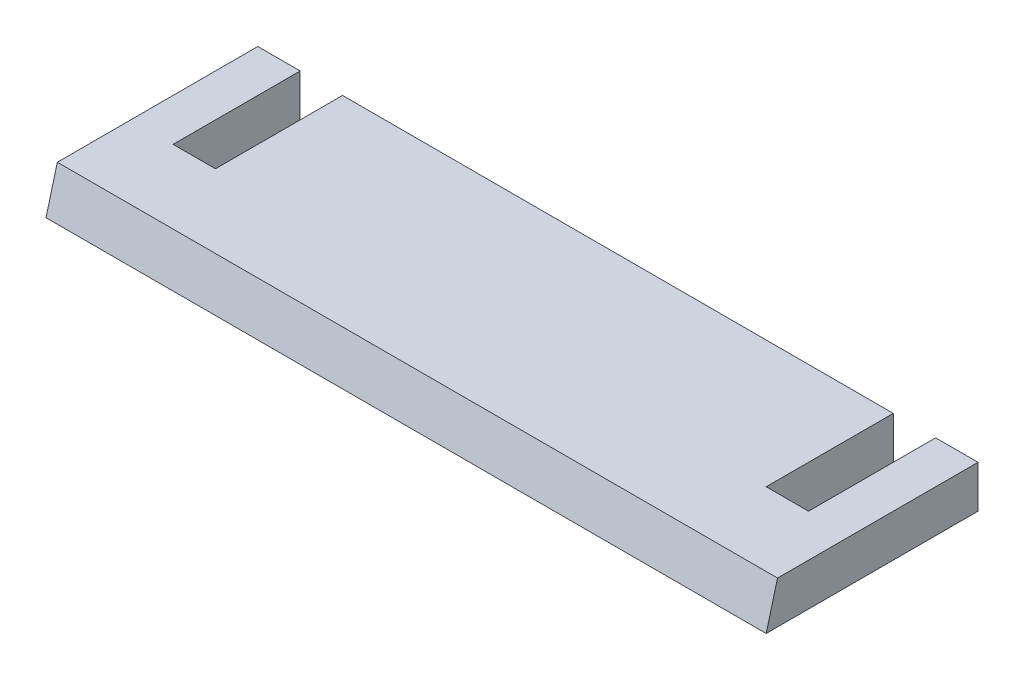
ISO-10303-21;
HEADER;
FILE_DESCRIPTION(('STEP AP214'),'2;1');
FILE_NAME('part.step','',(''),(''),'','','');
FILE_SCHEMA(('AUTOMOTIVE_DESIGN { 1 0 10303 214 1 1 1 1 }'));
ENDSEC;
DATA;
#1=APPLICATION_CONTEXT('core data for automotive mechanical design processes');
#2=APPLICATION_PROTOCOL_DEFINITION('international standard','automotive_design',2000,#1);
#3=PRODUCT_CONTEXT('',#1,'mechanical');
#4=PRODUCT('Part','Part','',(#3));
#5=PRODUCT_RELATED_PRODUCT_CATEGORY('part','',(#4));
#6=PRODUCT_DEFINITION_FORMATION('','',#4);
#7=PRODUCT_DEFINITION_CONTEXT('part definition',#1,'design');
#8=PRODUCT_DEFINITION('design','',#6,#7);
#9=PRODUCT_DEFINITION_SHAPE('','',#8);
#10=(LENGTH_UNIT() NAMED_UNIT(*) SI_UNIT(.MILLI.,.METRE.));
#11=(NAMED_UNIT(*) PLANE_ANGLE_UNIT() SI_UNIT($,.RADIAN.));
#12=(NAMED_UNIT(*) SI_UNIT($,.STERADIAN.) SOLID_ANGLE_UNIT());
#13=UNCERTAINTY_MEASURE_WITH_UNIT(LENGTH_MEASURE(1.E-05),#10,'distance_accuracy_value','');
#14=(GEOMETRIC_REPRESENTATION_CONTEXT(3) GLOBAL_UNCERTAINTY_ASSIGNED_CONTEXT((#13)) GLOBAL_UNIT_ASSIGNED_CONTEXT((#10,
#11,#12)) REPRESENTATION_CONTEXT('',''));
#15=CARTESIAN_POINT('',(0.,0.,0.));
#16=DIRECTION('',(0.,0.,1.));
#17=DIRECTION('',(1.,0.,0.));
#18=AXIS2_PLACEMENT_3D('',#15,#16,#17);
#19=CARTESIAN_POINT('',(75.,10.,-24.9999999999999));
#20=DIRECTION('',(0.,0.,1.));
#21=DIRECTION('',(1.,0.,0.));
#22=AXIS2_PLACEMENT_3D('',#19,#20,#21);
#23=PLANE('',#22);
#24=DIRECTION('',(-1.,0.,0.));
#25=VECTOR('',#24,1.);
#26=CARTESIAN_POINT('',(75.,0.,-24.9999999999999));
#27=LINE('',#26,#25);
#28=CARTESIAN_POINT('',(85.,0.,-25.));
#29=VERTEX_POINT('',#28);
#30=CARTESIAN_POINT('',(75.,0.,-24.9999999999999));
#31=VERTEX_POINT('',#30);
#32=EDGE_CURVE('E150',#29,#31,#27,.T.);
#33=ORIENTED_EDGE('',*,*,#32,.T.);
#34=DIRECTION('',(0.,-1.,0.));
#35=VECTOR('',#34,1.);
#36=CARTESIAN_POINT('',(75.,10.,-24.9999999999999));
#37=LINE('',#36,#35);
#38=CARTESIAN_POINT('',(75.,10.,-24.9999999999999));
#39=VERTEX_POINT('',#38);
#40=EDGE_CURVE('E11',#39,#31,#37,.T.);
#41=ORIENTED_EDGE('',*,*,#40,.F.);
#42=DIRECTION('',(-1.,0.,0.));
#43=VECTOR('',#42,1.);
#44=CARTESIAN_POINT('',(75.,10.,-24.9999999999999));
#45=LINE('',#44,#43);
#46=CARTESIAN_POINT('',(85.,10.,-25.));
#47=VERTEX_POINT('',#46);
#48=EDGE_CURVE('E141',#47,#39,#45,.T.);
#49=ORIENTED_EDGE('',*,*,#48,.F.);
#50=DIRECTION('',(0.,-1.,0.));
#51=VECTOR('',#50,1.);
#52=CARTESIAN_POINT('',(85.,10.,-25.));
#53=LINE('',#52,#51);
#54=EDGE_CURVE('E151',#47,#29,#53,.T.);
#55=ORIENTED_EDGE('',*,*,#54,.T.);
#56=EDGE_LOOP('',(#33,#41,#49,#55));
#57=FACE_BOUND('',#56,.T.);
#58=ADVANCED_FACE('F38',(#57),#23,.F.);
#59=CARTESIAN_POINT('',(75.,10.,-24.9999999999999));
#60=DIRECTION('',(1.,0.,0.));
#61=DIRECTION('',(0.,0.,-1.));
#62=AXIS2_PLACEMENT_3D('',#59,#60,#61);
#63=PLANE('',#62);
#64=DIRECTION('',(0.,0.,1.));
#65=VECTOR('',#64,1.);
#66=CARTESIAN_POINT('',(75.,0.,-24.9999999999999));
#67=LINE('',#66,#65);
#68=CARTESIAN_POINT('',(75.,0.,5.00000000000008));
#69=VERTEX_POINT('',#68);
#70=EDGE_CURVE('E154',#31,#69,#67,.T.);
#71=ORIENTED_EDGE('',*,*,#70,.T.);
#72=DIRECTION('',(0.,-1.,0.));
#73=VECTOR('',#72,1.);
#74=CARTESIAN_POINT('',(75.,10.,5.00000000000008));
#75=LINE('',#74,#73);
#76=CARTESIAN_POINT('',(75.,10.,5.00000000000008));
#77=VERTEX_POINT('',#76);
#78=EDGE_CURVE('E48',#77,#69,#75,.T.);
#79=ORIENTED_EDGE('',*,*,#78,.F.);
#80=DIRECTION('',(0.,0.,1.));
#81=VECTOR('',#80,1.);
#82=CARTESIAN_POINT('',(75.,10.,-24.9999999999999));
#83=LINE('',#82,#81);
#84=EDGE_CURVE('E134',#39,#77,#83,.T.);
#85=ORIENTED_EDGE('',*,*,#84,.F.);
#86=ORIENTED_EDGE('',*,*,#40,.T.);
#87=EDGE_LOOP('',(#71,#79,#85,#86));
#88=FACE_BOUND('',#87,.T.);
#89=ADVANCED_FACE('F135',(#88),#63,.F.);
#90=CARTESIAN_POINT('',(75.,10.,5.00000000000008));
#91=DIRECTION('',(0.,0.,1.));
#92=DIRECTION('',(1.,0.,0.));
#93=AXIS2_PLACEMENT_3D('',#90,#91,#92);
#94=PLANE('',#93);
#95=DIRECTION('',(-1.,0.,0.));
#96=VECTOR('',#95,1.);
#97=CARTESIAN_POINT('',(75.,0.,5.00000000000008));
#98=LINE('',#97,#96);
#99=CARTESIAN_POINT('',(65.,0.,5.00000000000006));
#100=VERTEX_POINT('',#99);
#101=EDGE_CURVE('E156',#69,#100,#98,.T.);
#102=ORIENTED_EDGE('',*,*,#101,.T.);
#103=DIRECTION('',(0.,-1.,0.));
#104=VECTOR('',#103,1.);
#105=CARTESIAN_POINT('',(65.,10.,5.00000000000006));
#106=LINE('',#105,#104);
#107=CARTESIAN_POINT('',(65.,10.,5.00000000000006));
#108=VERTEX_POINT('',#107);
#109=EDGE_CURVE('E199',#108,#100,#106,.T.);
#110=ORIENTED_EDGE('',*,*,#109,.F.);
#111=DIRECTION('',(-1.,0.,0.));
#112=VECTOR('',#111,1.);
#113=CARTESIAN_POINT('',(75.,10.,5.00000000000008));
#114=LINE('',#113,#112);
#115=EDGE_CURVE('E140',#77,#108,#114,.T.);
#116=ORIENTED_EDGE('',*,*,#115,.F.);
#117=ORIENTED_EDGE('',*,*,#78,.T.);
#118=EDGE_LOOP('',(#102,#110,#116,#117));
#119=FACE_BOUND('',#118,.T.);
#120=ADVANCED_FACE('F222',(#119),#94,.F.);
#121=CARTESIAN_POINT('',(65.,10.,5.00000000000006));
#122=DIRECTION('',(-1.,0.,0.));
#123=DIRECTION('',(0.,0.,1.));
#124=AXIS2_PLACEMENT_3D('',#121,#122,#123);
#125=PLANE('',#124);
#126=DIRECTION('',(0.,0.,-1.));
#127=VECTOR('',#126,1.);
#128=CARTESIAN_POINT('',(65.,0.,5.00000000000006));
#129=LINE('',#128,#127);
#130=CARTESIAN_POINT('',(65.,0.,-24.9999999999999));
#131=VERTEX_POINT('',#130);
#132=EDGE_CURVE('E162',#100,#131,#129,.T.);
#133=ORIENTED_EDGE('',*,*,#132,.T.);
#134=DIRECTION('',(0.,-1.,0.));
#135=VECTOR('',#134,1.);
#136=CARTESIAN_POINT('',(65.,10.,-24.9999999999999));
#137=LINE('',#136,#135);
#138=CARTESIAN_POINT('',(65.,10.,-24.9999999999999));
#139=VERTEX_POINT('',#138);
#140=EDGE_CURVE('E196',#139,#131,#137,.T.);
#141=ORIENTED_EDGE('',*,*,#140,.F.);
#142=DIRECTION('',(0.,0.,-1.));
#143=VECTOR('',#142,1.);
#144=CARTESIAN_POINT('',(65.,10.,5.00000000000006));
#145=LINE('',#144,#143);
#146=EDGE_CURVE('E216',#108,#139,#145,.T.);
#147=ORIENTED_EDGE('',*,*,#146,.F.);
#148=ORIENTED_EDGE('',*,*,#109,.T.);
#149=EDGE_LOOP('',(#133,#141,#147,#148));
#150=FACE_BOUND('',#149,.T.);
#151=ADVANCED_FACE('F226',(#150),#125,.F.);
#152=CARTESIAN_POINT('',(-65.,10.,-25.));
#153=DIRECTION('',(0.,0.,1.));
#154=DIRECTION('',(1.,0.,0.));
#155=AXIS2_PLACEMENT_3D('',#152,#153,#154);
#156=PLANE('',#155);
#157=DIRECTION('',(-1.,0.,0.));
#158=VECTOR('',#157,1.);
#159=CARTESIAN_POINT('',(-65.,0.,-25.));
#160=LINE('',#159,#158);
#161=CARTESIAN_POINT('',(-65.,0.,-25.));
#162=VERTEX_POINT('',#161);
#163=EDGE_CURVE('E164',#131,#162,#160,.T.);
#164=ORIENTED_EDGE('',*,*,#163,.T.);
#165=DIRECTION('',(0.,-1.,0.));
#166=VECTOR('',#165,1.);
#167=CARTESIAN_POINT('',(-65.,10.,-25.));
#168=LINE('',#167,#166);
#169=CARTESIAN_POINT('',(-65.,10.,-25.));
#170=VERTEX_POINT('',#169);
#171=EDGE_CURVE('E193',#170,#162,#168,.T.);
#172=ORIENTED_EDGE('',*,*,#171,.F.);
#173=DIRECTION('',(-1.,0.,0.));
#174=VECTOR('',#173,1.);
#175=CARTESIAN_POINT('',(-65.,10.,-25.));
#176=LINE('',#175,#174);
#177=EDGE_CURVE('E214',#139,#170,#176,.T.);
#178=ORIENTED_EDGE('',*,*,#177,.F.);
#179=ORIENTED_EDGE('',*,*,#140,.T.);
#180=EDGE_LOOP('',(#164,#172,#178,#179));
#181=FACE_BOUND('',#180,.T.);
#182=ADVANCED_FACE('F231',(#181),#156,.F.);
#183=CARTESIAN_POINT('',(-65.,10.,4.99999999999999));
#184=DIRECTION('',(1.,0.,0.));
#185=DIRECTION('',(0.,0.,-1.));
#186=AXIS2_PLACEMENT_3D('',#183,#184,#185);
#187=PLANE('',#186);
#188=DIRECTION('',(0.,0.,1.));
#189=VECTOR('',#188,1.);
#190=CARTESIAN_POINT('',(-65.,0.,4.99999999999999));
#191=LINE('',#190,#189);
#192=CARTESIAN_POINT('',(-65.,0.,4.99999999999999));
#193=VERTEX_POINT('',#192);
#194=EDGE_CURVE('E166',#162,#193,#191,.T.);
#195=ORIENTED_EDGE('',*,*,#194,.T.);
#196=DIRECTION('',(0.,-1.,0.));
#197=VECTOR('',#196,1.);
#198=CARTESIAN_POINT('',(-65.,10.,4.99999999999999));
#199=LINE('',#198,#197);
#200=CARTESIAN_POINT('',(-65.,10.,4.99999999999999));
#201=VERTEX_POINT('',#200);
#202=EDGE_CURVE('E190',#201,#193,#199,.T.);
#203=ORIENTED_EDGE('',*,*,#202,.F.);
#204=DIRECTION('',(0.,0.,1.));
#205=VECTOR('',#204,1.);
#206=CARTESIAN_POINT('',(-65.,10.,4.99999999999999));
#207=LINE('',#206,#205);
#208=EDGE_CURVE('E212',#170,#201,#207,.T.);
#209=ORIENTED_EDGE('',*,*,#208,.F.);
#210=ORIENTED_EDGE('',*,*,#171,.T.);
#211=EDGE_LOOP('',(#195,#203,#209,#210));
#212=FACE_BOUND('',#211,.T.);
#213=ADVANCED_FACE('F237',(#212),#187,.F.);
#214=CARTESIAN_POINT('',(-75.,10.,5.));
#215=DIRECTION('',(0.,0.,1.));
#216=DIRECTION('',(1.,0.,0.));
#217=AXIS2_PLACEMENT_3D('',#214,#215,#216);
#218=PLANE('',#217);
#219=DIRECTION('',(-1.,0.,0.));
#220=VECTOR('',#219,1.);
#221=CARTESIAN_POINT('',(-75.,0.,5.));
#222=LINE('',#221,#220);
#223=CARTESIAN_POINT('',(-75.,0.,5.));
#224=VERTEX_POINT('',#223);
#225=EDGE_CURVE('E168',#193,#224,#222,.T.);
#226=ORIENTED_EDGE('',*,*,#225,.T.);
#227=DIRECTION('',(0.,-1.,0.));
#228=VECTOR('',#227,1.);
#229=CARTESIAN_POINT('',(-75.,10.,5.));
#230=LINE('',#229,#228);
#231=CARTESIAN_POINT('',(-75.,10.,5.));
#232=VERTEX_POINT('',#231);
#233=EDGE_CURVE('E187',#232,#224,#230,.T.);
#234=ORIENTED_EDGE('',*,*,#233,.F.);
#235=DIRECTION('',(-1.,0.,0.));
#236=VECTOR('',#235,1.);
#237=CARTESIAN_POINT('',(-75.,10.,5.));
#238=LINE('',#237,#236);
#239=EDGE_CURVE('E210',#201,#232,#238,.T.);
#240=ORIENTED_EDGE('',*,*,#239,.F.);
#241=ORIENTED_EDGE('',*,*,#202,.T.);
#242=EDGE_LOOP('',(#226,#234,#240,#241));
#243=FACE_BOUND('',#242,.T.);
#244=ADVANCED_FACE('F241',(#243),#218,.F.);
#245=CARTESIAN_POINT('',(-75.,10.,-25.));
#246=DIRECTION('',(-1.,0.,0.));
#247=DIRECTION('',(0.,0.,1.));
#248=AXIS2_PLACEMENT_3D('',#245,#246,#247);
#249=PLANE('',#248);
#250=DIRECTION('',(0.,0.,-1.));
#251=VECTOR('',#250,1.);
#252=CARTESIAN_POINT('',(-75.,0.,-25.));
#253=LINE('',#252,#251);
#254=CARTESIAN_POINT('',(-75.,0.,-25.));
#255=VERTEX_POINT('',#254);
#256=EDGE_CURVE('E170',#224,#255,#253,.T.);
#257=ORIENTED_EDGE('',*,*,#256,.T.);
#258=DIRECTION('',(0.,-1.,0.));
#259=VECTOR('',#258,1.);
#260=CARTESIAN_POINT('',(-75.,10.,-25.));
#261=LINE('',#260,#259);
#262=CARTESIAN_POINT('',(-75.,10.,-25.));
#263=VERTEX_POINT('',#262);
#264=EDGE_CURVE('E183',#263,#255,#261,.T.);
#265=ORIENTED_EDGE('',*,*,#264,.F.);
#266=DIRECTION('',(0.,0.,-1.));
#267=VECTOR('',#266,1.);
#268=CARTESIAN_POINT('',(-75.,10.,-25.));
#269=LINE('',#268,#267);
#270=EDGE_CURVE('E112',#232,#263,#269,.T.);
#271=ORIENTED_EDGE('',*,*,#270,.F.);
#272=ORIENTED_EDGE('',*,*,#233,.T.);
#273=EDGE_LOOP('',(#257,#265,#271,#272));
#274=FACE_BOUND('',#273,.T.);
#275=ADVANCED_FACE('F244',(#274),#249,.F.);
#276=CARTESIAN_POINT('',(-85.,10.,-25.));
#277=DIRECTION('',(0.,0.,1.));
#278=DIRECTION('',(1.,0.,0.));
#279=AXIS2_PLACEMENT_3D('',#276,#277,#278);
#280=PLANE('',#279);
#281=DIRECTION('',(-1.,0.,0.));
#282=VECTOR('',#281,1.);
#283=CARTESIAN_POINT('',(-85.,0.,-25.));
#284=LINE('',#283,#282);
#285=CARTESIAN_POINT('',(-85.,0.,-25.));
#286=VERTEX_POINT('',#285);
#287=EDGE_CURVE('E172',#255,#286,#284,.T.);
#288=ORIENTED_EDGE('',*,*,#287,.T.);
#289=DIRECTION('',(0.,-1.,0.));
#290=VECTOR('',#289,1.);
#291=CARTESIAN_POINT('',(-85.,10.,-25.));
#292=LINE('',#291,#290);
#293=CARTESIAN_POINT('',(-85.,10.,-25.));
#294=VERTEX_POINT('',#293);
#295=EDGE_CURVE('E180',#294,#286,#292,.T.);
#296=ORIENTED_EDGE('',*,*,#295,.F.);
#297=DIRECTION('',(-1.,0.,0.));
#298=VECTOR('',#297,1.);
#299=CARTESIAN_POINT('',(-85.,10.,-25.));
#300=LINE('',#299,#298);
#301=EDGE_CURVE('E107',#263,#294,#300,.T.);
#302=ORIENTED_EDGE('',*,*,#301,.F.);
#303=ORIENTED_EDGE('',*,*,#264,.T.);
#304=EDGE_LOOP('',(#288,#296,#302,#303));
#305=FACE_BOUND('',#304,.T.);
#306=ADVANCED_FACE('F247',(#305),#280,.F.);
#307=CARTESIAN_POINT('',(-85.,10.,25.));
#308=DIRECTION('',(1.,0.,0.));
#309=DIRECTION('',(0.,0.,-1.));
#310=AXIS2_PLACEMENT_3D('',#307,#308,#309);
#311=PLANE('',#310);
#312=DIRECTION('',(0.,0.,1.));
#313=VECTOR('',#312,1.);
#314=CARTESIAN_POINT('',(-85.,0.,25.));
#315=LINE('',#314,#313);
#316=CARTESIAN_POINT('',(-85.,0.,25.));
#317=VERTEX_POINT('',#316);
#318=EDGE_CURVE('E174',#286,#317,#315,.T.);
#319=ORIENTED_EDGE('',*,*,#318,.T.);
#320=DIRECTION('',(0.,0.965925826289068,-0.258819045102521));
#321=VECTOR('',#320,1.);
#322=CARTESIAN_POINT('',(-85.,0.,25.));
#323=LINE('',#322,#321);
#324=CARTESIAN_POINT('',(-85.,10.,22.3205080756888));
#325=VERTEX_POINT('',#324);
#326=EDGE_CURVE('E184',#325,#317,#323,.F.);
#327=ORIENTED_EDGE('',*,*,#326,.F.);
#328=DIRECTION('',(0.,0.,1.));
#329=VECTOR('',#328,1.);
#330=CARTESIAN_POINT('',(-85.,10.,25.));
#331=LINE('',#330,#329);
#332=EDGE_CURVE('E102',#294,#325,#331,.T.);
#333=ORIENTED_EDGE('',*,*,#332,.F.);
#334=ORIENTED_EDGE('',*,*,#295,.T.);
#335=EDGE_LOOP('',(#319,#327,#333,#334));
#336=FACE_BOUND('',#335,.T.);
#337=ADVANCED_FACE('F250',(#336),#311,.F.);
#338=CARTESIAN_POINT('',(-85.,0.,25.));
#339=DIRECTION('',(0.,0.258819045102521,0.965925826289068));
#340=DIRECTION('',(0.,-0.965925826289068,0.258819045102521));
#341=AXIS2_PLACEMENT_3D('',#338,#339,#340);
#342=PLANE('',#341);
#343=DIRECTION('',(1.,0.,0.));
#344=VECTOR('',#343,1.);
#345=CARTESIAN_POINT('',(-85.,0.,25.));
#346=LINE('',#345,#344);
#347=CARTESIAN_POINT('',(85.,0.,25.));
#348=VERTEX_POINT('',#347);
#349=EDGE_CURVE('E176',#317,#348,#346,.T.);
#350=ORIENTED_EDGE('',*,*,#349,.T.);
#351=DIRECTION('',(0.,0.965925826289068,-0.258819045102521));
#352=VECTOR('',#351,1.);
#353=CARTESIAN_POINT('',(85.,9.33012701892219,22.5));
#354=LINE('',#353,#352);
#355=CARTESIAN_POINT('',(85.,10.,22.3205080756888));
#356=VERTEX_POINT('',#355);
#357=EDGE_CURVE('E42',#356,#348,#354,.F.);
#358=ORIENTED_EDGE('',*,*,#357,.F.);
#359=DIRECTION('',(-1.,0.,0.));
#360=VECTOR('',#359,1.);
#361=CARTESIAN_POINT('',(-85.,10.,22.3205080756888));
#362=LINE('',#361,#360);
#363=EDGE_CURVE('E204',#325,#356,#362,.F.);
#364=ORIENTED_EDGE('',*,*,#363,.F.);
#365=ORIENTED_EDGE('',*,*,#326,.T.);
#366=EDGE_LOOP('',(#350,#358,#364,#365));
#367=FACE_BOUND('',#366,.T.);
#368=ADVANCED_FACE('F40',(#367),#342,.T.);
#369=CARTESIAN_POINT('',(85.,10.,25.));
#370=DIRECTION('',(-1.,0.,0.));
#371=DIRECTION('',(0.,0.,1.));
#372=AXIS2_PLACEMENT_3D('',#369,#370,#371);
#373=PLANE('',#372);
#374=DIRECTION('',(0.,0.,-1.));
#375=VECTOR('',#374,1.);
#376=CARTESIAN_POINT('',(85.,0.,25.));
#377=LINE('',#376,#375);
#378=EDGE_CURVE('E147',#348,#29,#377,.T.);
#379=ORIENTED_EDGE('',*,*,#378,.T.);
#380=ORIENTED_EDGE('',*,*,#54,.F.);
#381=DIRECTION('',(0.,0.,-1.));
#382=VECTOR('',#381,1.);
#383=CARTESIAN_POINT('',(85.,10.,25.));
#384=LINE('',#383,#382);
#385=EDGE_CURVE('E56',#356,#47,#384,.T.);
#386=ORIENTED_EDGE('',*,*,#385,.F.);
#387=ORIENTED_EDGE('',*,*,#357,.T.);
#388=EDGE_LOOP('',(#379,#380,#386,#387));
#389=FACE_BOUND('',#388,.T.);
#390=ADVANCED_FACE('F255',(#389),#373,.F.);
#391=CARTESIAN_POINT('',(0.,10.,0.));
#392=DIRECTION('',(0.,1.,0.));
#393=DIRECTION('',(0.,0.,1.));
#394=AXIS2_PLACEMENT_3D('',#391,#392,#393);
#395=PLANE('',#394);
#396=ORIENTED_EDGE('',*,*,#48,.T.);
#397=ORIENTED_EDGE('',*,*,#84,.T.);
#398=ORIENTED_EDGE('',*,*,#115,.T.);
#399=ORIENTED_EDGE('',*,*,#146,.T.);
#400=ORIENTED_EDGE('',*,*,#177,.T.);
#401=ORIENTED_EDGE('',*,*,#208,.T.);
#402=ORIENTED_EDGE('',*,*,#239,.T.);
#403=ORIENTED_EDGE('',*,*,#270,.T.);
#404=ORIENTED_EDGE('',*,*,#301,.T.);
#405=ORIENTED_EDGE('',*,*,#332,.T.);
#406=ORIENTED_EDGE('',*,*,#363,.T.);
#407=ORIENTED_EDGE('',*,*,#385,.T.);
#408=EDGE_LOOP('',(#396,#397,#398,#399,#400,#401,#402,#403,#404,#405,#406,#407));
#409=FACE_BOUND('',#408,.T.);
#410=ADVANCED_FACE('F144',(#409),#395,.T.);
#411=CARTESIAN_POINT('',(0.,0.,0.));
#412=DIRECTION('',(0.,1.,0.));
#413=DIRECTION('',(0.,0.,1.));
#414=AXIS2_PLACEMENT_3D('',#411,#412,#413);
#415=PLANE('',#414);
#416=ORIENTED_EDGE('',*,*,#32,.F.);
#417=ORIENTED_EDGE('',*,*,#378,.F.);
#418=ORIENTED_EDGE('',*,*,#349,.F.);
#419=ORIENTED_EDGE('',*,*,#318,.F.);
#420=ORIENTED_EDGE('',*,*,#287,.F.);
#421=ORIENTED_EDGE('',*,*,#256,.F.);
#422=ORIENTED_EDGE('',*,*,#225,.F.);
#423=ORIENTED_EDGE('',*,*,#194,.F.);
#424=ORIENTED_EDGE('',*,*,#163,.F.);
#425=ORIENTED_EDGE('',*,*,#132,.F.);
#426=ORIENTED_EDGE('',*,*,#101,.F.);
#427=ORIENTED_EDGE('',*,*,#70,.F.);
#428=EDGE_LOOP('',(#416,#417,#418,#419,#420,#421,#422,#423,#424,#425,#426,#427));
#429=FACE_BOUND('',#428,.T.);
#430=ADVANCED_FACE('F256',(#429),#415,.F.);
#431=CLOSED_SHELL('',(#58,#89,#120,#151,#182,#213,#244,#275,#306,#337,#368,#390,#410,#430));
#432=MANIFOLD_SOLID_BREP('B2',#431);
#433=ADVANCED_BREP_SHAPE_REPRESENTATION('',(#18,#432),#14);
#434=SHAPE_DEFINITION_REPRESENTATION(#9,#433);
ENDSEC;
END-ISO-10303-21;
